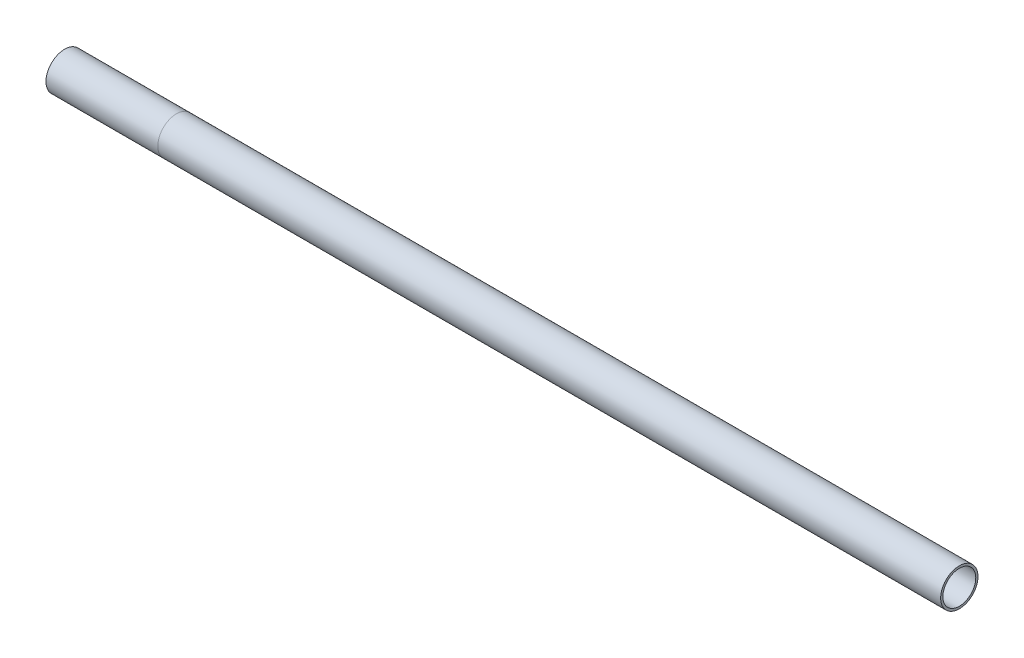
ISO-10303-21;
HEADER;
FILE_DESCRIPTION(('STEP AP214'),'2;1');
FILE_NAME('part.step','',(''),(''),'','','');
FILE_SCHEMA(('AUTOMOTIVE_DESIGN { 1 0 10303 214 1 1 1 1 }'));
ENDSEC;
DATA;
#1=APPLICATION_CONTEXT('core data for automotive mechanical design processes');
#2=APPLICATION_PROTOCOL_DEFINITION('international standard','automotive_design',2000,#1);
#3=PRODUCT_CONTEXT('',#1,'mechanical');
#4=PRODUCT('Part','Part','',(#3));
#5=PRODUCT_RELATED_PRODUCT_CATEGORY('part','',(#4));
#6=PRODUCT_DEFINITION_FORMATION('','',#4);
#7=PRODUCT_DEFINITION_CONTEXT('part definition',#1,'design');
#8=PRODUCT_DEFINITION('design','',#6,#7);
#9=PRODUCT_DEFINITION_SHAPE('','',#8);
#10=(LENGTH_UNIT() NAMED_UNIT(*) SI_UNIT(.MILLI.,.METRE.));
#11=(NAMED_UNIT(*) PLANE_ANGLE_UNIT() SI_UNIT($,.RADIAN.));
#12=(NAMED_UNIT(*) SI_UNIT($,.STERADIAN.) SOLID_ANGLE_UNIT());
#13=UNCERTAINTY_MEASURE_WITH_UNIT(LENGTH_MEASURE(1.E-05),#10,'distance_accuracy_value','');
#14=(GEOMETRIC_REPRESENTATION_CONTEXT(3) GLOBAL_UNCERTAINTY_ASSIGNED_CONTEXT((#13)) GLOBAL_UNIT_ASSIGNED_CONTEXT((#10,
#11,#12)) REPRESENTATION_CONTEXT('',''));
#15=CARTESIAN_POINT('',(0.,0.,0.));
#16=DIRECTION('',(0.,0.,1.));
#17=DIRECTION('',(1.,0.,0.));
#18=AXIS2_PLACEMENT_3D('',#15,#16,#17);
#19=CARTESIAN_POINT('',(0.,5.18417051804128,2.71956486192329));
#20=DIRECTION('',(1.,0.,0.));
#21=DIRECTION('',(0.,0.,-1.));
#22=AXIS2_PLACEMENT_3D('',#19,#20,#21);
#23=CYLINDRICAL_SURFACE('',#22,8.35);
#24=CARTESIAN_POINT('',(50.,5.18417051804128,2.71956486192329));
#25=DIRECTION('',(1.,0.,0.));
#26=DIRECTION('',(0.,0.,-1.));
#27=AXIS2_PLACEMENT_3D('',#24,#25,#26);
#28=CIRCLE('',#27,8.35);
#29=CARTESIAN_POINT('',(50.,5.18417051804128,-5.63043513807671));
#30=VERTEX_POINT('',#29);
#31=EDGE_CURVE('E35',#30,#30,#28,.T.);
#32=ORIENTED_EDGE('',*,*,#31,.F.);
#33=EDGE_LOOP('',(#32));
#34=FACE_BOUND('',#33,.T.);
#35=CARTESIAN_POINT('',(0.,5.18417051804128,2.71956486192329));
#36=DIRECTION('',(1.,0.,0.));
#37=DIRECTION('',(0.,0.,-1.));
#38=AXIS2_PLACEMENT_3D('',#35,#36,#37);
#39=CIRCLE('',#38,8.35);
#40=CARTESIAN_POINT('',(0.,5.18417051804128,-5.63043513807671));
#41=VERTEX_POINT('',#40);
#42=EDGE_CURVE('E50',#41,#41,#39,.T.);
#43=ORIENTED_EDGE('',*,*,#42,.T.);
#44=EDGE_LOOP('',(#43));
#45=FACE_BOUND('',#44,.T.);
#46=ADVANCED_FACE('F31',(#34,#45),#23,.T.);
#47=CARTESIAN_POINT('',(50.,5.18417051804128,2.71956486192329));
#48=DIRECTION('',(1.,0.,0.));
#49=DIRECTION('',(0.,0.,-1.));
#50=AXIS2_PLACEMENT_3D('',#47,#48,#49);
#51=CYLINDRICAL_SURFACE('',#50,8.35);
#52=CARTESIAN_POINT('',(400.,5.18417051804128,2.71956486192329));
#53=DIRECTION('',(1.,0.,0.));
#54=DIRECTION('',(0.,0.,-1.));
#55=AXIS2_PLACEMENT_3D('',#52,#53,#54);
#56=CIRCLE('',#55,8.35);
#57=CARTESIAN_POINT('',(400.,5.18417051804128,-5.63043513807671));
#58=VERTEX_POINT('',#57);
#59=EDGE_CURVE('E48',#58,#58,#56,.T.);
#60=ORIENTED_EDGE('',*,*,#59,.F.);
#61=EDGE_LOOP('',(#60));
#62=FACE_BOUND('',#61,.T.);
#63=ORIENTED_EDGE('',*,*,#31,.T.);
#64=EDGE_LOOP('',(#63));
#65=FACE_BOUND('',#64,.T.);
#66=ADVANCED_FACE('F33',(#62,#65),#51,.T.);
#67=CARTESIAN_POINT('',(0.,5.18417051804128,2.71956486192329));
#68=DIRECTION('',(1.,0.,0.));
#69=DIRECTION('',(0.,0.,-1.));
#70=AXIS2_PLACEMENT_3D('',#67,#68,#69);
#71=PLANE('',#70);
#72=CARTESIAN_POINT('',(0.,5.18417051804128,2.71956486192329));
#73=DIRECTION('',(1.,0.,0.));
#74=DIRECTION('',(0.,0.,-1.));
#75=AXIS2_PLACEMENT_3D('',#72,#73,#74);
#76=CIRCLE('',#75,7.35);
#77=CARTESIAN_POINT('',(0.,5.18417051804128,-4.63043513807671));
#78=VERTEX_POINT('',#77);
#79=EDGE_CURVE('E44',#78,#78,#76,.F.);
#80=ORIENTED_EDGE('',*,*,#79,.F.);
#81=EDGE_LOOP('',(#80));
#82=FACE_BOUND('',#81,.T.);
#83=ORIENTED_EDGE('',*,*,#42,.F.);
#84=EDGE_LOOP('',(#83));
#85=FACE_BOUND('',#84,.T.);
#86=ADVANCED_FACE('F62',(#82,#85),#71,.F.);
#87=CARTESIAN_POINT('',(400.,5.18417051804128,2.71956486192329));
#88=DIRECTION('',(1.,0.,0.));
#89=DIRECTION('',(0.,0.,-1.));
#90=AXIS2_PLACEMENT_3D('',#87,#88,#89);
#91=PLANE('',#90);
#92=CARTESIAN_POINT('',(400.,5.18417051804128,2.71956486192329));
#93=DIRECTION('',(1.,0.,0.));
#94=DIRECTION('',(0.,0.,-1.));
#95=AXIS2_PLACEMENT_3D('',#92,#93,#94);
#96=CIRCLE('',#95,7.35);
#97=CARTESIAN_POINT('',(400.,5.18417051804128,-4.63043513807671));
#98=VERTEX_POINT('',#97);
#99=EDGE_CURVE('E10',#98,#98,#96,.F.);
#100=ORIENTED_EDGE('',*,*,#99,.T.);
#101=EDGE_LOOP('',(#100));
#102=FACE_BOUND('',#101,.T.);
#103=ORIENTED_EDGE('',*,*,#59,.T.);
#104=EDGE_LOOP('',(#103));
#105=FACE_BOUND('',#104,.T.);
#106=ADVANCED_FACE('F73',(#102,#105),#91,.T.);
#107=CARTESIAN_POINT('',(0.,5.18417051804128,2.71956486192329));
#108=DIRECTION('',(1.,0.,0.));
#109=DIRECTION('',(0.,0.,-1.));
#110=AXIS2_PLACEMENT_3D('',#107,#108,#109);
#111=CYLINDRICAL_SURFACE('',#110,7.35);
#112=CARTESIAN_POINT('',(50.,5.18417051804128,2.71956486192329));
#113=DIRECTION('',(1.,0.,0.));
#114=DIRECTION('',(0.,0.,-1.));
#115=AXIS2_PLACEMENT_3D('',#112,#113,#114);
#116=CIRCLE('',#115,7.35);
#117=CARTESIAN_POINT('',(50.,5.18417051804128,-4.63043513807671));
#118=VERTEX_POINT('',#117);
#119=EDGE_CURVE('E39',#118,#118,#116,.F.);
#120=ORIENTED_EDGE('',*,*,#119,.F.);
#121=EDGE_LOOP('',(#120));
#122=FACE_BOUND('',#121,.T.);
#123=ORIENTED_EDGE('',*,*,#79,.T.);
#124=EDGE_LOOP('',(#123));
#125=FACE_BOUND('',#124,.T.);
#126=ADVANCED_FACE('F67',(#122,#125),#111,.F.);
#127=CARTESIAN_POINT('',(50.,5.18417051804128,2.71956486192329));
#128=DIRECTION('',(1.,0.,0.));
#129=DIRECTION('',(0.,0.,-1.));
#130=AXIS2_PLACEMENT_3D('',#127,#128,#129);
#131=CYLINDRICAL_SURFACE('',#130,7.35);
#132=ORIENTED_EDGE('',*,*,#99,.F.);
#133=EDGE_LOOP('',(#132));
#134=FACE_BOUND('',#133,.T.);
#135=ORIENTED_EDGE('',*,*,#119,.T.);
#136=EDGE_LOOP('',(#135));
#137=FACE_BOUND('',#136,.T.);
#138=ADVANCED_FACE('F65',(#134,#137),#131,.F.);
#139=CLOSED_SHELL('',(#46,#66,#86,#106,#126,#138));
#140=MANIFOLD_SOLID_BREP('B2',#139);
#141=ADVANCED_BREP_SHAPE_REPRESENTATION('',(#18,#140),#14);
#142=SHAPE_DEFINITION_REPRESENTATION(#9,#141);
ENDSEC;
END-ISO-10303-21;
